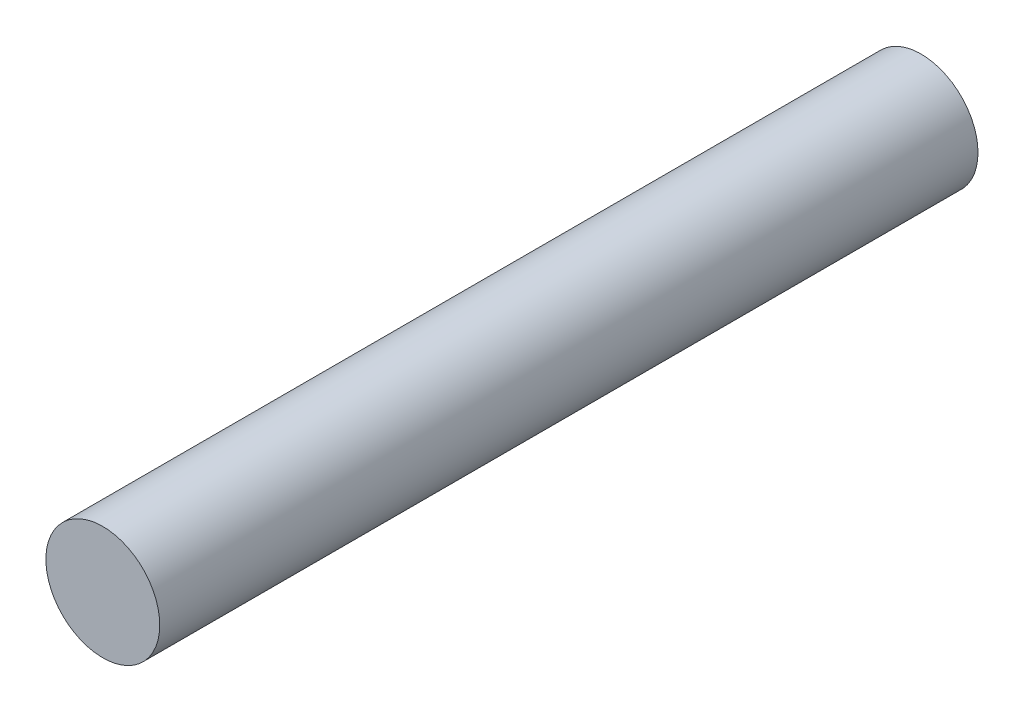
ISO-10303-21;
HEADER;
FILE_DESCRIPTION(('STEP AP214'),'2;1');
FILE_NAME('part.step','',(''),(''),'','','');
FILE_SCHEMA(('AUTOMOTIVE_DESIGN { 1 0 10303 214 1 1 1 1 }'));
ENDSEC;
DATA;
#1=APPLICATION_CONTEXT('core data for automotive mechanical design processes');
#2=APPLICATION_PROTOCOL_DEFINITION('international standard','automotive_design',2000,#1);
#3=PRODUCT_CONTEXT('',#1,'mechanical');
#4=PRODUCT('Part','Part','',(#3));
#5=PRODUCT_RELATED_PRODUCT_CATEGORY('part','',(#4));
#6=PRODUCT_DEFINITION_FORMATION('','',#4);
#7=PRODUCT_DEFINITION_CONTEXT('part definition',#1,'design');
#8=PRODUCT_DEFINITION('design','',#6,#7);
#9=PRODUCT_DEFINITION_SHAPE('','',#8);
#10=(LENGTH_UNIT() NAMED_UNIT(*) SI_UNIT(.MILLI.,.METRE.));
#11=(NAMED_UNIT(*) PLANE_ANGLE_UNIT() SI_UNIT($,.RADIAN.));
#12=(NAMED_UNIT(*) SI_UNIT($,.STERADIAN.) SOLID_ANGLE_UNIT());
#13=UNCERTAINTY_MEASURE_WITH_UNIT(LENGTH_MEASURE(1.E-05),#10,'distance_accuracy_value','');
#14=(GEOMETRIC_REPRESENTATION_CONTEXT(3) GLOBAL_UNCERTAINTY_ASSIGNED_CONTEXT((#13)) GLOBAL_UNIT_ASSIGNED_CONTEXT((#10,
#11,#12)) REPRESENTATION_CONTEXT('',''));
#15=CARTESIAN_POINT('',(0.,0.,0.));
#16=DIRECTION('',(0.,0.,1.));
#17=DIRECTION('',(1.,0.,0.));
#18=AXIS2_PLACEMENT_3D('',#15,#16,#17);
#19=CARTESIAN_POINT('',(0.,0.,69.));
#20=DIRECTION('',(0.,0.,-1.));
#21=DIRECTION('',(-1.,0.,0.));
#22=AXIS2_PLACEMENT_3D('',#19,#20,#21);
#23=CYLINDRICAL_SURFACE('',#22,6.4);
#24=CARTESIAN_POINT('',(0.,0.,69.));
#25=DIRECTION('',(0.,0.,1.));
#26=DIRECTION('',(1.,0.,0.));
#27=AXIS2_PLACEMENT_3D('',#24,#25,#26);
#28=CIRCLE('',#27,6.4);
#29=CARTESIAN_POINT('',(6.4,0.,69.));
#30=VERTEX_POINT('',#29);
#31=EDGE_CURVE('E10',#30,#30,#28,.T.);
#32=ORIENTED_EDGE('',*,*,#31,.F.);
#33=EDGE_LOOP('',(#32));
#34=FACE_BOUND('',#33,.T.);
#35=CARTESIAN_POINT('',(0.,0.,-23.));
#36=DIRECTION('',(0.,0.,1.));
#37=DIRECTION('',(1.,0.,0.));
#38=AXIS2_PLACEMENT_3D('',#35,#36,#37);
#39=CIRCLE('',#38,6.4);
#40=CARTESIAN_POINT('',(6.4,0.,-23.));
#41=VERTEX_POINT('',#40);
#42=EDGE_CURVE('E36',#41,#41,#39,.T.);
#43=ORIENTED_EDGE('',*,*,#42,.T.);
#44=EDGE_LOOP('',(#43));
#45=FACE_BOUND('',#44,.T.);
#46=ADVANCED_FACE('F33',(#34,#45),#23,.T.);
#47=CARTESIAN_POINT('',(0.,0.,69.));
#48=DIRECTION('',(0.,0.,1.));
#49=DIRECTION('',(1.,0.,0.));
#50=AXIS2_PLACEMENT_3D('',#47,#48,#49);
#51=PLANE('',#50);
#52=ORIENTED_EDGE('',*,*,#31,.T.);
#53=EDGE_LOOP('',(#52));
#54=FACE_BOUND('',#53,.T.);
#55=ADVANCED_FACE('F48',(#54),#51,.T.);
#56=CARTESIAN_POINT('',(0.,0.,-23.));
#57=DIRECTION('',(0.,0.,1.));
#58=DIRECTION('',(1.,0.,0.));
#59=AXIS2_PLACEMENT_3D('',#56,#57,#58);
#60=PLANE('',#59);
#61=ORIENTED_EDGE('',*,*,#42,.F.);
#62=EDGE_LOOP('',(#61));
#63=FACE_BOUND('',#62,.T.);
#64=ADVANCED_FACE('F46',(#63),#60,.F.);
#65=CLOSED_SHELL('',(#46,#55,#64));
#66=MANIFOLD_SOLID_BREP('B2',#65);
#67=ADVANCED_BREP_SHAPE_REPRESENTATION('',(#18,#66),#14);
#68=SHAPE_DEFINITION_REPRESENTATION(#9,#67);
ENDSEC;
END-ISO-10303-21;
